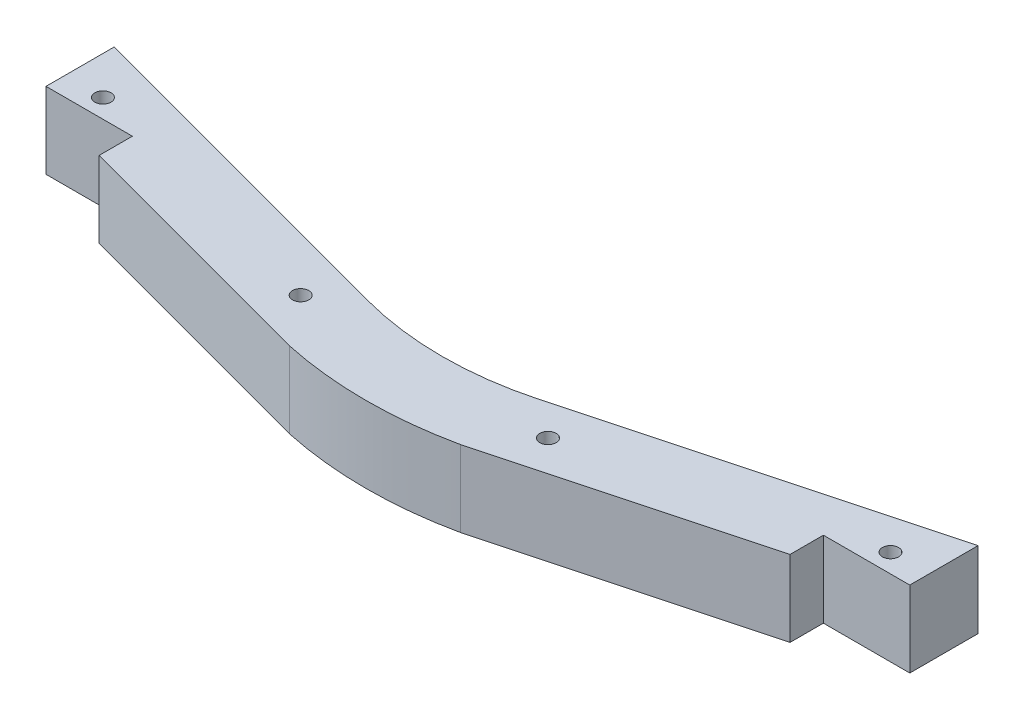
ISO-10303-21;
HEADER;
FILE_DESCRIPTION(('STEP AP214'),'2;1');
FILE_NAME('part.step','',(''),(''),'','','');
FILE_SCHEMA(('AUTOMOTIVE_DESIGN { 1 0 10303 214 1 1 1 1 }'));
ENDSEC;
DATA;
#1=APPLICATION_CONTEXT('core data for automotive mechanical design processes');
#2=APPLICATION_PROTOCOL_DEFINITION('international standard','automotive_design',2000,#1);
#3=PRODUCT_CONTEXT('',#1,'mechanical');
#4=PRODUCT('Part','Part','',(#3));
#5=PRODUCT_RELATED_PRODUCT_CATEGORY('part','',(#4));
#6=PRODUCT_DEFINITION_FORMATION('','',#4);
#7=PRODUCT_DEFINITION_CONTEXT('part definition',#1,'design');
#8=PRODUCT_DEFINITION('design','',#6,#7);
#9=PRODUCT_DEFINITION_SHAPE('','',#8);
#10=(LENGTH_UNIT() NAMED_UNIT(*) SI_UNIT(.MILLI.,.METRE.));
#11=(NAMED_UNIT(*) PLANE_ANGLE_UNIT() SI_UNIT($,.RADIAN.));
#12=(NAMED_UNIT(*) SI_UNIT($,.STERADIAN.) SOLID_ANGLE_UNIT());
#13=UNCERTAINTY_MEASURE_WITH_UNIT(LENGTH_MEASURE(1.E-05),#10,'distance_accuracy_value','');
#14=(GEOMETRIC_REPRESENTATION_CONTEXT(3) GLOBAL_UNCERTAINTY_ASSIGNED_CONTEXT((#13)) GLOBAL_UNIT_ASSIGNED_CONTEXT((#10,
#11,#12)) REPRESENTATION_CONTEXT('',''));
#15=CARTESIAN_POINT('',(0.,0.,0.));
#16=DIRECTION('',(0.,0.,1.));
#17=DIRECTION('',(1.,0.,0.));
#18=AXIS2_PLACEMENT_3D('',#15,#16,#17);
#19=CARTESIAN_POINT('',(0.,15.,0.));
#20=DIRECTION('',(0.,-1.,0.));
#21=DIRECTION('',(0.,0.,-1.));
#22=AXIS2_PLACEMENT_3D('',#19,#20,#21);
#23=CYLINDRICAL_SURFACE('',#22,80.055);
#24=CARTESIAN_POINT('',(0.,0.,0.));
#25=DIRECTION('',(0.,1.,0.));
#26=DIRECTION('',(0.,0.,1.));
#27=AXIS2_PLACEMENT_3D('',#24,#25,#26);
#28=CIRCLE('',#27,80.055);
#29=CARTESIAN_POINT('',(-16.84,0.,78.263768277537));
#30=VERTEX_POINT('',#29);
#31=CARTESIAN_POINT('',(16.84,0.,78.263768277537));
#32=VERTEX_POINT('',#31);
#33=EDGE_CURVE('E71',#30,#32,#28,.T.);
#34=ORIENTED_EDGE('',*,*,#33,.T.);
#35=DIRECTION('',(0.,-1.,0.));
#36=VECTOR('',#35,1.);
#37=CARTESIAN_POINT('',(16.84,15.,78.263768277537));
#38=LINE('',#37,#36);
#39=CARTESIAN_POINT('',(16.84,15.,78.263768277537));
#40=VERTEX_POINT('',#39);
#41=EDGE_CURVE('E51',#40,#32,#38,.T.);
#42=ORIENTED_EDGE('',*,*,#41,.F.);
#43=CARTESIAN_POINT('',(0.,15.,0.));
#44=DIRECTION('',(0.,1.,0.));
#45=DIRECTION('',(0.,0.,1.));
#46=AXIS2_PLACEMENT_3D('',#43,#44,#45);
#47=CIRCLE('',#46,80.055);
#48=CARTESIAN_POINT('',(-16.84,15.,78.263768277537));
#49=VERTEX_POINT('',#48);
#50=EDGE_CURVE('E104',#49,#40,#47,.T.);
#51=ORIENTED_EDGE('',*,*,#50,.F.);
#52=DIRECTION('',(0.,-1.,0.));
#53=VECTOR('',#52,1.);
#54=CARTESIAN_POINT('',(-16.84,15.,78.263768277537));
#55=LINE('',#54,#53);
#56=EDGE_CURVE('E11',#49,#30,#55,.T.);
#57=ORIENTED_EDGE('',*,*,#56,.T.);
#58=EDGE_LOOP('',(#34,#42,#51,#57));
#59=FACE_BOUND('',#58,.T.);
#60=ADVANCED_FACE('F43',(#59),#23,.T.);
#61=CARTESIAN_POINT('',(0.,15.,0.));
#62=DIRECTION('',(0.,-1.,0.));
#63=DIRECTION('',(0.,0.,-1.));
#64=AXIS2_PLACEMENT_3D('',#61,#62,#63);
#65=CYLINDRICAL_SURFACE('',#64,65.055);
#66=CARTESIAN_POINT('',(0.,0.,0.));
#67=DIRECTION('',(0.,1.,0.));
#68=DIRECTION('',(0.,0.,1.));
#69=AXIS2_PLACEMENT_3D('',#66,#67,#68);
#70=CIRCLE('',#69,65.055);
#71=CARTESIAN_POINT('',(-16.84,0.,62.8376274615775));
#72=VERTEX_POINT('',#71);
#73=CARTESIAN_POINT('',(16.84,0.,62.8376274615775));
#74=VERTEX_POINT('',#73);
#75=EDGE_CURVE('E77',#72,#74,#70,.T.);
#76=ORIENTED_EDGE('',*,*,#75,.F.);
#77=DIRECTION('',(0.,-1.,0.));
#78=VECTOR('',#77,1.);
#79=CARTESIAN_POINT('',(-16.84,15.,62.8376274615775));
#80=LINE('',#79,#78);
#81=CARTESIAN_POINT('',(-16.84,15.,62.8376274615775));
#82=VERTEX_POINT('',#81);
#83=EDGE_CURVE('E59',#82,#72,#80,.T.);
#84=ORIENTED_EDGE('',*,*,#83,.F.);
#85=CARTESIAN_POINT('',(0.,15.,0.));
#86=DIRECTION('',(0.,1.,0.));
#87=DIRECTION('',(0.,0.,1.));
#88=AXIS2_PLACEMENT_3D('',#85,#86,#87);
#89=CIRCLE('',#88,65.055);
#90=CARTESIAN_POINT('',(16.84,15.,62.8376274615775));
#91=VERTEX_POINT('',#90);
#92=EDGE_CURVE('E118',#82,#91,#89,.T.);
#93=ORIENTED_EDGE('',*,*,#92,.T.);
#94=DIRECTION('',(0.,-1.,0.));
#95=VECTOR('',#94,1.);
#96=CARTESIAN_POINT('',(16.84,15.,62.8376274615775));
#97=LINE('',#96,#95);
#98=EDGE_CURVE('E124',#91,#74,#97,.T.);
#99=ORIENTED_EDGE('',*,*,#98,.T.);
#100=EDGE_LOOP('',(#76,#84,#93,#99));
#101=FACE_BOUND('',#100,.T.);
#102=ADVANCED_FACE('F228',(#101),#65,.F.);
#103=CARTESIAN_POINT('',(0.,15.,0.));
#104=DIRECTION('',(0.,1.,0.));
#105=DIRECTION('',(0.,0.,1.));
#106=AXIS2_PLACEMENT_3D('',#103,#104,#105);
#107=PLANE('',#106);
#108=ORIENTED_EDGE('',*,*,#92,.F.);
#109=DIRECTION('',(-0.965925826289067,0.,-0.258819045102525));
#110=VECTOR('',#109,1.);
#111=CARTESIAN_POINT('',(-16.8374729655297,15.,62.8383045784231));
#112=LINE('',#111,#110);
#113=CARTESIAN_POINT('',(-84.9978352538866,15.,44.5747905474447));
#114=VERTEX_POINT('',#113);
#115=EDGE_CURVE('E197',#82,#114,#112,.T.);
#116=ORIENTED_EDGE('',*,*,#115,.T.);
#117=DIRECTION('',(0.,0.,1.));
#118=VECTOR('',#117,1.);
#119=CARTESIAN_POINT('',(-84.9978352538866,15.,0.));
#120=LINE('',#119,#118);
#121=CARTESIAN_POINT('',(-84.9978352538866,15.,58.0009313634042));
#122=VERTEX_POINT('',#121);
#123=EDGE_CURVE('E184',#114,#122,#120,.T.);
#124=ORIENTED_EDGE('',*,*,#123,.T.);
#125=DIRECTION('',(-1.,0.,0.));
#126=VECTOR('',#125,1.);
#127=CARTESIAN_POINT('',(0.,15.,58.0009313634042));
#128=LINE('',#127,#126);
#129=CARTESIAN_POINT('',(-67.9978352538866,15.,58.0009313634042));
#130=VERTEX_POINT('',#129);
#131=EDGE_CURVE('E190',#130,#122,#128,.T.);
#132=ORIENTED_EDGE('',*,*,#131,.F.);
#133=DIRECTION('',(0.,0.,-1.));
#134=VECTOR('',#133,1.);
#135=CARTESIAN_POINT('',(-67.9978352538866,15.,0.));
#136=LINE('',#135,#134);
#137=CARTESIAN_POINT('',(-67.9978352538866,15.,64.5560676347334));
#138=VERTEX_POINT('',#137);
#139=EDGE_CURVE('E185',#138,#130,#136,.T.);
#140=ORIENTED_EDGE('',*,*,#139,.F.);
#141=DIRECTION('',(0.965925826289067,0.,0.258819045102525));
#142=VECTOR('',#141,1.);
#143=CARTESIAN_POINT('',(-20.6940081695196,15.,77.2310899008912));
#144=LINE('',#143,#142);
#145=EDGE_CURVE('E115',#138,#49,#144,.T.);
#146=ORIENTED_EDGE('',*,*,#145,.T.);
#147=ORIENTED_EDGE('',*,*,#50,.T.);
#148=DIRECTION('',(-0.965925826289067,0.,0.258819045102525));
#149=VECTOR('',#148,1.);
#150=CARTESIAN_POINT('',(20.6940081695196,15.,77.2310899008912));
#151=LINE('',#150,#149);
#152=CARTESIAN_POINT('',(67.9978352538866,15.,64.5560676347334));
#153=VERTEX_POINT('',#152);
#154=EDGE_CURVE('E111',#153,#40,#151,.T.);
#155=ORIENTED_EDGE('',*,*,#154,.F.);
#156=DIRECTION('',(0.,0.,-1.));
#157=VECTOR('',#156,1.);
#158=CARTESIAN_POINT('',(67.9978352538866,15.,0.));
#159=LINE('',#158,#157);
#160=CARTESIAN_POINT('',(67.9978352538866,15.,58.0009313634042));
#161=VERTEX_POINT('',#160);
#162=EDGE_CURVE('E149',#153,#161,#159,.T.);
#163=ORIENTED_EDGE('',*,*,#162,.T.);
#164=DIRECTION('',(1.,0.,0.));
#165=VECTOR('',#164,1.);
#166=CARTESIAN_POINT('',(0.,15.,58.0009313634042));
#167=LINE('',#166,#165);
#168=CARTESIAN_POINT('',(84.9978352538866,15.,58.0009313634042));
#169=VERTEX_POINT('',#168);
#170=EDGE_CURVE('E145',#161,#169,#167,.T.);
#171=ORIENTED_EDGE('',*,*,#170,.T.);
#172=DIRECTION('',(0.,0.,1.));
#173=VECTOR('',#172,1.);
#174=CARTESIAN_POINT('',(84.9978352538866,15.,0.));
#175=LINE('',#174,#173);
#176=CARTESIAN_POINT('',(84.9978352538866,15.,44.5747905474448));
#177=VERTEX_POINT('',#176);
#178=EDGE_CURVE('E140',#177,#169,#175,.T.);
#179=ORIENTED_EDGE('',*,*,#178,.F.);
#180=DIRECTION('',(0.965925826289067,0.,-0.258819045102525));
#181=VECTOR('',#180,1.);
#182=CARTESIAN_POINT('',(16.8374729655297,15.,62.8383045784231));
#183=LINE('',#182,#181);
#184=EDGE_CURVE('E132',#91,#177,#183,.T.);
#185=ORIENTED_EDGE('',*,*,#184,.F.);
#186=EDGE_LOOP('',(#108,#116,#124,#132,#140,#146,#147,#155,#163,#171,#179,#185));
#187=FACE_BOUND('',#186,.T.);
#188=CARTESIAN_POINT('',(-77.4978352538866,15.,54.297479898658));
#189=DIRECTION('',(0.,1.,0.));
#190=DIRECTION('',(0.,0.,1.));
#191=AXIS2_PLACEMENT_3D('',#188,#189,#190);
#192=CIRCLE('',#191,1.60000000000001);
#193=CARTESIAN_POINT('',(-77.4978352538866,15.,55.897479898658));
#194=VERTEX_POINT('',#193);
#195=EDGE_CURVE('E200',#194,#194,#192,.F.);
#196=ORIENTED_EDGE('',*,*,#195,.T.);
#197=EDGE_LOOP('',(#196));
#198=FACE_BOUND('',#197,.T.);
#199=CARTESIAN_POINT('',(-24.3356705077692,15.,68.5422390102707));
#200=DIRECTION('',(0.,1.,0.));
#201=DIRECTION('',(0.,0.,1.));
#202=AXIS2_PLACEMENT_3D('',#199,#200,#201);
#203=CIRCLE('',#202,1.6);
#204=CARTESIAN_POINT('',(-24.3356705077692,15.,70.1422390102707));
#205=VERTEX_POINT('',#204);
#206=EDGE_CURVE('E179',#205,#205,#203,.F.);
#207=ORIENTED_EDGE('',*,*,#206,.T.);
#208=EDGE_LOOP('',(#207));
#209=FACE_BOUND('',#208,.T.);
#210=CARTESIAN_POINT('',(77.4978352538865,15.,54.297479898658));
#211=DIRECTION('',(0.,1.,0.));
#212=DIRECTION('',(0.,0.,1.));
#213=AXIS2_PLACEMENT_3D('',#210,#211,#212);
#214=CIRCLE('',#213,1.60000000000001);
#215=CARTESIAN_POINT('',(77.4978352538865,15.,55.897479898658));
#216=VERTEX_POINT('',#215);
#217=EDGE_CURVE('E156',#216,#216,#214,.T.);
#218=ORIENTED_EDGE('',*,*,#217,.F.);
#219=EDGE_LOOP('',(#218));
#220=FACE_BOUND('',#219,.T.);
#221=CARTESIAN_POINT('',(24.3356705077692,15.,68.5422390102707));
#222=DIRECTION('',(0.,1.,0.));
#223=DIRECTION('',(0.,0.,1.));
#224=AXIS2_PLACEMENT_3D('',#221,#222,#223);
#225=CIRCLE('',#224,1.6);
#226=CARTESIAN_POINT('',(24.3356705077692,15.,70.1422390102707));
#227=VERTEX_POINT('',#226);
#228=EDGE_CURVE('E152',#227,#227,#225,.T.);
#229=ORIENTED_EDGE('',*,*,#228,.F.);
#230=EDGE_LOOP('',(#229));
#231=FACE_BOUND('',#230,.T.);
#232=ADVANCED_FACE('F106',(#187,#198,#209,#220,#231),#107,.T.);
#233=CARTESIAN_POINT('',(0.,0.,0.));
#234=DIRECTION('',(0.,1.,0.));
#235=DIRECTION('',(0.,0.,1.));
#236=AXIS2_PLACEMENT_3D('',#233,#234,#235);
#237=PLANE('',#236);
#238=ORIENTED_EDGE('',*,*,#33,.F.);
#239=DIRECTION('',(-0.965925826289067,0.,-0.258819045102525));
#240=VECTOR('',#239,1.);
#241=CARTESIAN_POINT('',(-20.6940081695196,0.,77.2310899008912));
#242=LINE('',#241,#240);
#243=CARTESIAN_POINT('',(-67.9978352538866,0.,64.5560676347334));
#244=VERTEX_POINT('',#243);
#245=EDGE_CURVE('E208',#30,#244,#242,.T.);
#246=ORIENTED_EDGE('',*,*,#245,.T.);
#247=DIRECTION('',(0.,0.,1.));
#248=VECTOR('',#247,1.);
#249=CARTESIAN_POINT('',(-67.9978352538866,0.,0.));
#250=LINE('',#249,#248);
#251=CARTESIAN_POINT('',(-67.9978352538866,0.,58.0009313634042));
#252=VERTEX_POINT('',#251);
#253=EDGE_CURVE('E165',#252,#244,#250,.T.);
#254=ORIENTED_EDGE('',*,*,#253,.F.);
#255=DIRECTION('',(1.,0.,0.));
#256=VECTOR('',#255,1.);
#257=CARTESIAN_POINT('',(0.,0.,58.0009313634042));
#258=LINE('',#257,#256);
#259=CARTESIAN_POINT('',(-84.9978352538866,0.,58.0009313634042));
#260=VERTEX_POINT('',#259);
#261=EDGE_CURVE('E188',#260,#252,#258,.T.);
#262=ORIENTED_EDGE('',*,*,#261,.F.);
#263=DIRECTION('',(0.,0.,-1.));
#264=VECTOR('',#263,1.);
#265=CARTESIAN_POINT('',(-84.9978352538866,0.,0.));
#266=LINE('',#265,#264);
#267=CARTESIAN_POINT('',(-84.9978352538866,0.,44.5747905474447));
#268=VERTEX_POINT('',#267);
#269=EDGE_CURVE('E210',#260,#268,#266,.T.);
#270=ORIENTED_EDGE('',*,*,#269,.T.);
#271=DIRECTION('',(0.965925826289067,0.,0.258819045102526));
#272=VECTOR('',#271,1.);
#273=CARTESIAN_POINT('',(-16.8374729655297,0.,62.8383045784231));
#274=LINE('',#273,#272);
#275=EDGE_CURVE('E217',#268,#72,#274,.T.);
#276=ORIENTED_EDGE('',*,*,#275,.T.);
#277=ORIENTED_EDGE('',*,*,#75,.T.);
#278=DIRECTION('',(-0.965925826289067,0.,0.258819045102525));
#279=VECTOR('',#278,1.);
#280=CARTESIAN_POINT('',(16.8374729655297,0.,62.8383045784231));
#281=LINE('',#280,#279);
#282=CARTESIAN_POINT('',(84.9978352538866,0.,44.5747905474448));
#283=VERTEX_POINT('',#282);
#284=EDGE_CURVE('E129',#283,#74,#281,.T.);
#285=ORIENTED_EDGE('',*,*,#284,.F.);
#286=DIRECTION('',(0.,0.,-1.));
#287=VECTOR('',#286,1.);
#288=CARTESIAN_POINT('',(84.9978352538866,0.,0.));
#289=LINE('',#288,#287);
#290=CARTESIAN_POINT('',(84.9978352538866,0.,58.0009313634042));
#291=VERTEX_POINT('',#290);
#292=EDGE_CURVE('E139',#291,#283,#289,.T.);
#293=ORIENTED_EDGE('',*,*,#292,.F.);
#294=DIRECTION('',(-1.,0.,0.));
#295=VECTOR('',#294,1.);
#296=CARTESIAN_POINT('',(0.,0.,58.0009313634042));
#297=LINE('',#296,#295);
#298=CARTESIAN_POINT('',(67.9978352538866,0.,58.0009313634042));
#299=VERTEX_POINT('',#298);
#300=EDGE_CURVE('E163',#291,#299,#297,.T.);
#301=ORIENTED_EDGE('',*,*,#300,.T.);
#302=DIRECTION('',(0.,0.,1.));
#303=VECTOR('',#302,1.);
#304=CARTESIAN_POINT('',(67.9978352538866,0.,0.));
#305=LINE('',#304,#303);
#306=CARTESIAN_POINT('',(67.9978352538866,0.,64.5560676347334));
#307=VERTEX_POINT('',#306);
#308=EDGE_CURVE('E148',#299,#307,#305,.T.);
#309=ORIENTED_EDGE('',*,*,#308,.T.);
#310=DIRECTION('',(0.965925826289067,0.,-0.258819045102525));
#311=VECTOR('',#310,1.);
#312=CARTESIAN_POINT('',(20.6940081695196,0.,77.2310899008912));
#313=LINE('',#312,#311);
#314=EDGE_CURVE('E134',#32,#307,#313,.T.);
#315=ORIENTED_EDGE('',*,*,#314,.F.);
#316=EDGE_LOOP('',(#238,#246,#254,#262,#270,#276,#277,#285,#293,#301,#309,#315));
#317=FACE_BOUND('',#316,.T.);
#318=CARTESIAN_POINT('',(-24.3356705077692,0.,68.5422390102707));
#319=DIRECTION('',(0.,1.,0.));
#320=DIRECTION('',(0.,0.,1.));
#321=AXIS2_PLACEMENT_3D('',#318,#319,#320);
#322=CIRCLE('',#321,1.6);
#323=CARTESIAN_POINT('',(-24.3356705077692,0.,70.1422390102707));
#324=VERTEX_POINT('',#323);
#325=EDGE_CURVE('E182',#324,#324,#322,.T.);
#326=ORIENTED_EDGE('',*,*,#325,.T.);
#327=EDGE_LOOP('',(#326));
#328=FACE_BOUND('',#327,.T.);
#329=CARTESIAN_POINT('',(-77.4978352538866,0.,54.297479898658));
#330=DIRECTION('',(0.,1.,0.));
#331=DIRECTION('',(0.,0.,1.));
#332=AXIS2_PLACEMENT_3D('',#329,#330,#331);
#333=CIRCLE('',#332,1.60000000000001);
#334=CARTESIAN_POINT('',(-77.4978352538866,0.,55.897479898658));
#335=VERTEX_POINT('',#334);
#336=EDGE_CURVE('E211',#335,#335,#333,.T.);
#337=ORIENTED_EDGE('',*,*,#336,.T.);
#338=EDGE_LOOP('',(#337));
#339=FACE_BOUND('',#338,.T.);
#340=CARTESIAN_POINT('',(77.4978352538865,0.,54.297479898658));
#341=DIRECTION('',(0.,1.,0.));
#342=DIRECTION('',(0.,0.,1.));
#343=AXIS2_PLACEMENT_3D('',#340,#341,#342);
#344=CIRCLE('',#343,1.60000000000001);
#345=CARTESIAN_POINT('',(77.4978352538865,0.,55.897479898658));
#346=VERTEX_POINT('',#345);
#347=EDGE_CURVE('E155',#346,#346,#344,.F.);
#348=ORIENTED_EDGE('',*,*,#347,.F.);
#349=EDGE_LOOP('',(#348));
#350=FACE_BOUND('',#349,.T.);
#351=CARTESIAN_POINT('',(24.3356705077692,0.,68.5422390102707));
#352=DIRECTION('',(0.,1.,0.));
#353=DIRECTION('',(0.,0.,1.));
#354=AXIS2_PLACEMENT_3D('',#351,#352,#353);
#355=CIRCLE('',#354,1.6);
#356=CARTESIAN_POINT('',(24.3356705077692,0.,70.1422390102707));
#357=VERTEX_POINT('',#356);
#358=EDGE_CURVE('E143',#357,#357,#355,.F.);
#359=ORIENTED_EDGE('',*,*,#358,.F.);
#360=EDGE_LOOP('',(#359));
#361=FACE_BOUND('',#360,.T.);
#362=ADVANCED_FACE('F232',(#317,#328,#339,#350,#361),#237,.F.);
#363=CARTESIAN_POINT('',(-20.6940081695196,-76.0291899667135,77.2310899008912));
#364=DIRECTION('',(-0.258819045102525,0.,0.965925826289067));
#365=DIRECTION('',(0.965925826289067,0.,0.258819045102525));
#366=AXIS2_PLACEMENT_3D('',#363,#364,#365);
#367=PLANE('',#366);
#368=ORIENTED_EDGE('',*,*,#245,.F.);
#369=ORIENTED_EDGE('',*,*,#56,.F.);
#370=ORIENTED_EDGE('',*,*,#145,.F.);
#371=DIRECTION('',(0.,1.,0.));
#372=VECTOR('',#371,1.);
#373=CARTESIAN_POINT('',(-67.9978352538866,-76.0291899667135,64.5560676347334));
#374=LINE('',#373,#372);
#375=EDGE_CURVE('E189',#244,#138,#374,.T.);
#376=ORIENTED_EDGE('',*,*,#375,.F.);
#377=EDGE_LOOP('',(#368,#369,#370,#376));
#378=FACE_BOUND('',#377,.T.);
#379=ADVANCED_FACE('F300',(#378),#367,.T.);
#380=CARTESIAN_POINT('',(-67.9978352538866,-76.0291899667135,0.));
#381=DIRECTION('',(1.,0.,0.));
#382=DIRECTION('',(0.,0.,-1.));
#383=AXIS2_PLACEMENT_3D('',#380,#381,#382);
#384=PLANE('',#383);
#385=DIRECTION('',(0.,1.,0.));
#386=VECTOR('',#385,1.);
#387=CARTESIAN_POINT('',(-67.9978352538866,-76.0291899667135,58.0009313634042));
#388=LINE('',#387,#386);
#389=EDGE_CURVE('E194',#252,#130,#388,.T.);
#390=ORIENTED_EDGE('',*,*,#389,.F.);
#391=ORIENTED_EDGE('',*,*,#253,.T.);
#392=ORIENTED_EDGE('',*,*,#375,.T.);
#393=ORIENTED_EDGE('',*,*,#139,.T.);
#394=EDGE_LOOP('',(#390,#391,#392,#393));
#395=FACE_BOUND('',#394,.T.);
#396=ADVANCED_FACE('F308',(#395),#384,.F.);
#397=CARTESIAN_POINT('',(0.,-76.0291899667135,58.0009313634042));
#398=DIRECTION('',(0.,0.,-1.));
#399=DIRECTION('',(-1.,0.,0.));
#400=AXIS2_PLACEMENT_3D('',#397,#398,#399);
#401=PLANE('',#400);
#402=DIRECTION('',(0.,1.,0.));
#403=VECTOR('',#402,1.);
#404=CARTESIAN_POINT('',(-84.9978352538866,-76.0291899667135,58.0009313634042));
#405=LINE('',#404,#403);
#406=EDGE_CURVE('E193',#260,#122,#405,.T.);
#407=ORIENTED_EDGE('',*,*,#406,.F.);
#408=ORIENTED_EDGE('',*,*,#261,.T.);
#409=ORIENTED_EDGE('',*,*,#389,.T.);
#410=ORIENTED_EDGE('',*,*,#131,.T.);
#411=EDGE_LOOP('',(#407,#408,#409,#410));
#412=FACE_BOUND('',#411,.T.);
#413=ADVANCED_FACE('F272',(#412),#401,.F.);
#414=CARTESIAN_POINT('',(-84.9978352538866,-76.0291899667135,0.));
#415=DIRECTION('',(-1.,0.,0.));
#416=DIRECTION('',(0.,0.,1.));
#417=AXIS2_PLACEMENT_3D('',#414,#415,#416);
#418=PLANE('',#417);
#419=ORIENTED_EDGE('',*,*,#269,.F.);
#420=ORIENTED_EDGE('',*,*,#406,.T.);
#421=ORIENTED_EDGE('',*,*,#123,.F.);
#422=DIRECTION('',(0.,1.,0.));
#423=VECTOR('',#422,1.);
#424=CARTESIAN_POINT('',(-84.9978352538866,-76.0291899667135,44.5747905474447));
#425=LINE('',#424,#423);
#426=EDGE_CURVE('E203',#268,#114,#425,.T.);
#427=ORIENTED_EDGE('',*,*,#426,.F.);
#428=EDGE_LOOP('',(#419,#420,#421,#427));
#429=FACE_BOUND('',#428,.T.);
#430=ADVANCED_FACE('F270',(#429),#418,.T.);
#431=CARTESIAN_POINT('',(-16.8374729655297,-76.0291899667135,62.8383045784231));
#432=DIRECTION('',(0.258819045102525,0.,-0.965925826289067));
#433=DIRECTION('',(-0.965925826289067,0.,-0.258819045102526));
#434=AXIS2_PLACEMENT_3D('',#431,#432,#433);
#435=PLANE('',#434);
#436=ORIENTED_EDGE('',*,*,#275,.F.);
#437=ORIENTED_EDGE('',*,*,#426,.T.);
#438=ORIENTED_EDGE('',*,*,#115,.F.);
#439=ORIENTED_EDGE('',*,*,#83,.T.);
#440=EDGE_LOOP('',(#436,#437,#438,#439));
#441=FACE_BOUND('',#440,.T.);
#442=ADVANCED_FACE('F276',(#441),#435,.T.);
#443=CARTESIAN_POINT('',(-77.4978352538866,-76.0291899667135,54.297479898658));
#444=DIRECTION('',(0.,1.,0.));
#445=DIRECTION('',(0.,0.,1.));
#446=AXIS2_PLACEMENT_3D('',#443,#444,#445);
#447=CYLINDRICAL_SURFACE('',#446,1.60000000000001);
#448=ORIENTED_EDGE('',*,*,#336,.F.);
#449=EDGE_LOOP('',(#448));
#450=FACE_BOUND('',#449,.T.);
#451=ORIENTED_EDGE('',*,*,#195,.F.);
#452=EDGE_LOOP('',(#451));
#453=FACE_BOUND('',#452,.T.);
#454=ADVANCED_FACE('F278',(#450,#453),#447,.F.);
#455=CARTESIAN_POINT('',(-24.3356705077692,-76.0291899667135,68.5422390102707));
#456=DIRECTION('',(0.,1.,0.));
#457=DIRECTION('',(0.,0.,1.));
#458=AXIS2_PLACEMENT_3D('',#455,#456,#457);
#459=CYLINDRICAL_SURFACE('',#458,1.6);
#460=ORIENTED_EDGE('',*,*,#325,.F.);
#461=EDGE_LOOP('',(#460));
#462=FACE_BOUND('',#461,.T.);
#463=ORIENTED_EDGE('',*,*,#206,.F.);
#464=EDGE_LOOP('',(#463));
#465=FACE_BOUND('',#464,.T.);
#466=ADVANCED_FACE('F284',(#462,#465),#459,.F.);
#467=CARTESIAN_POINT('',(67.9978352538866,-76.0291899667135,0.));
#468=DIRECTION('',(1.,0.,0.));
#469=DIRECTION('',(0.,0.,-1.));
#470=AXIS2_PLACEMENT_3D('',#467,#468,#469);
#471=PLANE('',#470);
#472=ORIENTED_EDGE('',*,*,#308,.F.);
#473=DIRECTION('',(0.,1.,0.));
#474=VECTOR('',#473,1.);
#475=CARTESIAN_POINT('',(67.9978352538866,-76.0291899667135,58.0009313634042));
#476=LINE('',#475,#474);
#477=EDGE_CURVE('E171',#299,#161,#476,.T.);
#478=ORIENTED_EDGE('',*,*,#477,.T.);
#479=ORIENTED_EDGE('',*,*,#162,.F.);
#480=DIRECTION('',(0.,1.,0.));
#481=VECTOR('',#480,1.);
#482=CARTESIAN_POINT('',(67.9978352538866,-76.0291899667135,64.5560676347334));
#483=LINE('',#482,#481);
#484=EDGE_CURVE('E128',#307,#153,#483,.T.);
#485=ORIENTED_EDGE('',*,*,#484,.F.);
#486=EDGE_LOOP('',(#472,#478,#479,#485));
#487=FACE_BOUND('',#486,.T.);
#488=ADVANCED_FACE('F303',(#487),#471,.T.);
#489=CARTESIAN_POINT('',(20.6940081695196,-76.0291899667135,77.2310899008912));
#490=DIRECTION('',(-0.258819045102525,0.,-0.965925826289067));
#491=DIRECTION('',(-0.965925826289067,0.,0.258819045102525));
#492=AXIS2_PLACEMENT_3D('',#489,#490,#491);
#493=PLANE('',#492);
#494=ORIENTED_EDGE('',*,*,#41,.T.);
#495=ORIENTED_EDGE('',*,*,#314,.T.);
#496=ORIENTED_EDGE('',*,*,#484,.T.);
#497=ORIENTED_EDGE('',*,*,#154,.T.);
#498=EDGE_LOOP('',(#494,#495,#496,#497));
#499=FACE_BOUND('',#498,.T.);
#500=ADVANCED_FACE('F126',(#499),#493,.F.);
#501=CARTESIAN_POINT('',(16.8374729655297,-76.0291899667135,62.8383045784231));
#502=DIRECTION('',(0.258819045102525,0.,0.965925826289067));
#503=DIRECTION('',(0.965925826289067,0.,-0.258819045102525));
#504=AXIS2_PLACEMENT_3D('',#501,#502,#503);
#505=PLANE('',#504);
#506=DIRECTION('',(0.,1.,0.));
#507=VECTOR('',#506,1.);
#508=CARTESIAN_POINT('',(84.9978352538866,-76.0291899667135,44.5747905474448));
#509=LINE('',#508,#507);
#510=EDGE_CURVE('E144',#283,#177,#509,.T.);
#511=ORIENTED_EDGE('',*,*,#510,.F.);
#512=ORIENTED_EDGE('',*,*,#284,.T.);
#513=ORIENTED_EDGE('',*,*,#98,.F.);
#514=ORIENTED_EDGE('',*,*,#184,.T.);
#515=EDGE_LOOP('',(#511,#512,#513,#514));
#516=FACE_BOUND('',#515,.T.);
#517=ADVANCED_FACE('F238',(#516),#505,.F.);
#518=CARTESIAN_POINT('',(84.9978352538866,-76.0291899667135,0.));
#519=DIRECTION('',(-1.,0.,0.));
#520=DIRECTION('',(0.,0.,1.));
#521=AXIS2_PLACEMENT_3D('',#518,#519,#520);
#522=PLANE('',#521);
#523=DIRECTION('',(0.,1.,0.));
#524=VECTOR('',#523,1.);
#525=CARTESIAN_POINT('',(84.9978352538866,-76.0291899667135,58.0009313634042));
#526=LINE('',#525,#524);
#527=EDGE_CURVE('E151',#291,#169,#526,.T.);
#528=ORIENTED_EDGE('',*,*,#527,.F.);
#529=ORIENTED_EDGE('',*,*,#292,.T.);
#530=ORIENTED_EDGE('',*,*,#510,.T.);
#531=ORIENTED_EDGE('',*,*,#178,.T.);
#532=EDGE_LOOP('',(#528,#529,#530,#531));
#533=FACE_BOUND('',#532,.T.);
#534=ADVANCED_FACE('F245',(#533),#522,.F.);
#535=CARTESIAN_POINT('',(24.3356705077692,-76.0291899667135,68.5422390102707));
#536=DIRECTION('',(0.,1.,0.));
#537=DIRECTION('',(0.,0.,1.));
#538=AXIS2_PLACEMENT_3D('',#535,#536,#537);
#539=CYLINDRICAL_SURFACE('',#538,1.6);
#540=ORIENTED_EDGE('',*,*,#358,.T.);
#541=EDGE_LOOP('',(#540));
#542=FACE_BOUND('',#541,.T.);
#543=ORIENTED_EDGE('',*,*,#228,.T.);
#544=EDGE_LOOP('',(#543));
#545=FACE_BOUND('',#544,.T.);
#546=ADVANCED_FACE('F377',(#542,#545),#539,.F.);
#547=CARTESIAN_POINT('',(77.4978352538865,-76.0291899667135,54.297479898658));
#548=DIRECTION('',(0.,1.,0.));
#549=DIRECTION('',(0.,0.,1.));
#550=AXIS2_PLACEMENT_3D('',#547,#548,#549);
#551=CYLINDRICAL_SURFACE('',#550,1.60000000000001);
#552=ORIENTED_EDGE('',*,*,#347,.T.);
#553=EDGE_LOOP('',(#552));
#554=FACE_BOUND('',#553,.T.);
#555=ORIENTED_EDGE('',*,*,#217,.T.);
#556=EDGE_LOOP('',(#555));
#557=FACE_BOUND('',#556,.T.);
#558=ADVANCED_FACE('F387',(#554,#557),#551,.F.);
#559=CARTESIAN_POINT('',(0.,-76.0291899667135,58.0009313634042));
#560=DIRECTION('',(0.,0.,1.));
#561=DIRECTION('',(1.,0.,0.));
#562=AXIS2_PLACEMENT_3D('',#559,#560,#561);
#563=PLANE('',#562);
#564=ORIENTED_EDGE('',*,*,#300,.F.);
#565=ORIENTED_EDGE('',*,*,#527,.T.);
#566=ORIENTED_EDGE('',*,*,#170,.F.);
#567=ORIENTED_EDGE('',*,*,#477,.F.);
#568=EDGE_LOOP('',(#564,#565,#566,#567));
#569=FACE_BOUND('',#568,.T.);
#570=ADVANCED_FACE('F255',(#569),#563,.T.);
#571=CLOSED_SHELL('',(#60,#102,#232,#362,#379,#396,#413,#430,#442,#454,#466,#488,#500,#517,#534,
#546,#558,#570));
#572=MANIFOLD_SOLID_BREP('B2',#571);
#573=ADVANCED_BREP_SHAPE_REPRESENTATION('',(#18,#572),#14);
#574=SHAPE_DEFINITION_REPRESENTATION(#9,#573);
ENDSEC;
END-ISO-10303-21;
